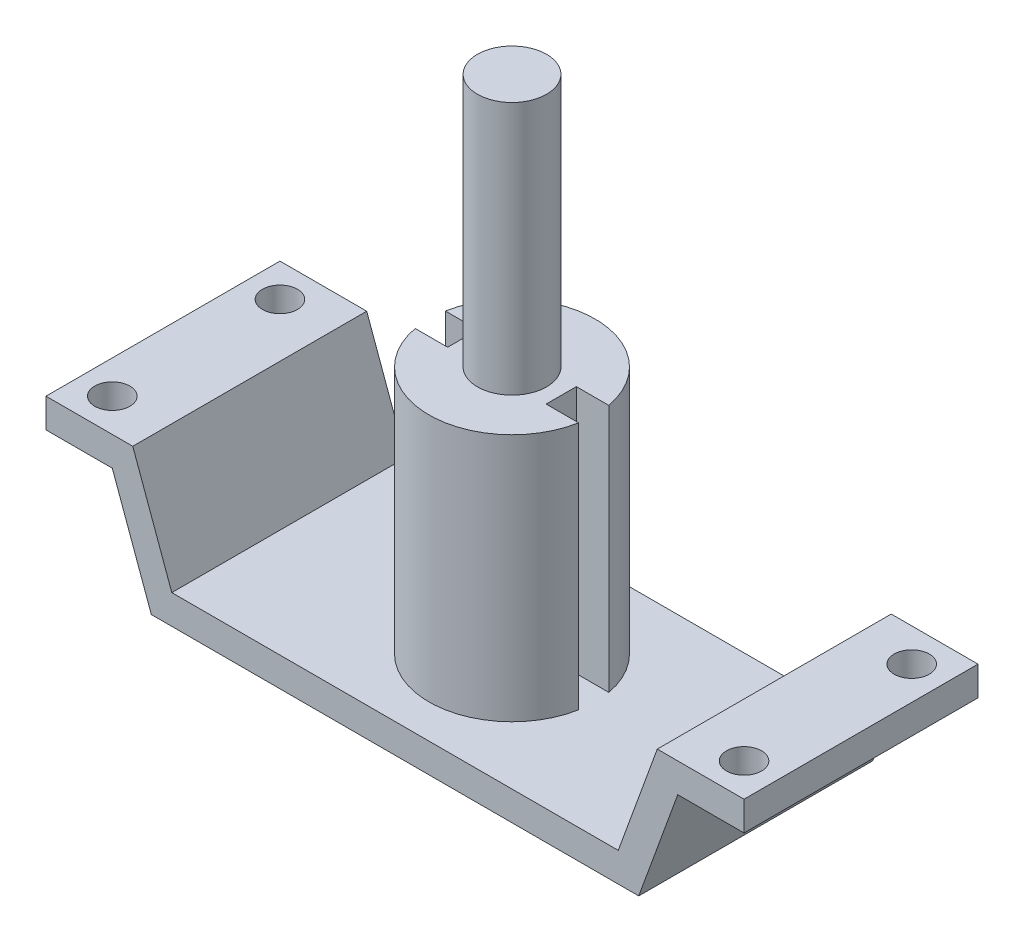
ISO-10303-21;
HEADER;
FILE_DESCRIPTION(('STEP AP214'),'2;1');
FILE_NAME('part.step','',(''),(''),'','','');
FILE_SCHEMA(('AUTOMOTIVE_DESIGN { 1 0 10303 214 1 1 1 1 }'));
ENDSEC;
DATA;
#1=APPLICATION_CONTEXT('core data for automotive mechanical design processes');
#2=APPLICATION_PROTOCOL_DEFINITION('international standard','automotive_design',2000,#1);
#3=PRODUCT_CONTEXT('',#1,'mechanical');
#4=PRODUCT('Part','Part','',(#3));
#5=PRODUCT_RELATED_PRODUCT_CATEGORY('part','',(#4));
#6=PRODUCT_DEFINITION_FORMATION('','',#4);
#7=PRODUCT_DEFINITION_CONTEXT('part definition',#1,'design');
#8=PRODUCT_DEFINITION('design','',#6,#7);
#9=PRODUCT_DEFINITION_SHAPE('','',#8);
#10=(LENGTH_UNIT() NAMED_UNIT(*) SI_UNIT(.MILLI.,.METRE.));
#11=(NAMED_UNIT(*) PLANE_ANGLE_UNIT() SI_UNIT($,.RADIAN.));
#12=(NAMED_UNIT(*) SI_UNIT($,.STERADIAN.) SOLID_ANGLE_UNIT());
#13=UNCERTAINTY_MEASURE_WITH_UNIT(LENGTH_MEASURE(1.E-05),#10,'distance_accuracy_value','');
#14=(GEOMETRIC_REPRESENTATION_CONTEXT(3) GLOBAL_UNCERTAINTY_ASSIGNED_CONTEXT((#13)) GLOBAL_UNIT_ASSIGNED_CONTEXT((#10,
#11,#12)) REPRESENTATION_CONTEXT('',''));
#15=CARTESIAN_POINT('',(0.,0.,0.));
#16=DIRECTION('',(0.,0.,1.));
#17=DIRECTION('',(1.,0.,0.));
#18=AXIS2_PLACEMENT_3D('',#15,#16,#17);
#19=CARTESIAN_POINT('',(0.,28.5,0.));
#20=DIRECTION('',(0.,-1.,0.));
#21=DIRECTION('',(0.,0.,-1.));
#22=AXIS2_PLACEMENT_3D('',#19,#20,#21);
#23=CYLINDRICAL_SURFACE('',#22,8.525);
#24=CARTESIAN_POINT('',(0.,28.5,0.));
#25=DIRECTION('',(0.,1.,0.));
#26=DIRECTION('',(0.,0.,1.));
#27=AXIS2_PLACEMENT_3D('',#24,#25,#26);
#28=CIRCLE('',#27,8.525);
#29=CARTESIAN_POINT('',(-8.38290671545377,28.5,1.55));
#30=VERTEX_POINT('',#29);
#31=CARTESIAN_POINT('',(8.38290671545377,28.5,1.55));
#32=VERTEX_POINT('',#31);
#33=EDGE_CURVE('E241',#30,#32,#28,.T.);
#34=ORIENTED_EDGE('',*,*,#33,.F.);
#35=DIRECTION('',(0.,-1.,0.));
#36=VECTOR('',#35,1.);
#37=CARTESIAN_POINT('',(-8.38290671545377,28.5,1.55));
#38=LINE('',#37,#36);
#39=CARTESIAN_POINT('',(-8.38290671545377,3.,1.55));
#40=VERTEX_POINT('',#39);
#41=EDGE_CURVE('E184',#30,#40,#38,.T.);
#42=ORIENTED_EDGE('',*,*,#41,.T.);
#43=CARTESIAN_POINT('',(0.,3.,0.));
#44=DIRECTION('',(0.,1.,0.));
#45=DIRECTION('',(0.,0.,1.));
#46=AXIS2_PLACEMENT_3D('',#43,#44,#45);
#47=CIRCLE('',#46,8.525);
#48=CARTESIAN_POINT('',(8.38290671545377,3.,1.55));
#49=VERTEX_POINT('',#48);
#50=EDGE_CURVE('E236',#40,#49,#47,.T.);
#51=ORIENTED_EDGE('',*,*,#50,.T.);
#52=DIRECTION('',(0.,-1.,0.));
#53=VECTOR('',#52,1.);
#54=CARTESIAN_POINT('',(8.38290671545377,28.5,1.55));
#55=LINE('',#54,#53);
#56=EDGE_CURVE('E226',#49,#32,#55,.F.);
#57=ORIENTED_EDGE('',*,*,#56,.T.);
#58=EDGE_LOOP('',(#34,#42,#51,#57));
#59=FACE_BOUND('',#58,.T.);
#60=ADVANCED_FACE('F43',(#59),#23,.T.);
#61=CARTESIAN_POINT('',(-25.,3.,-12.));
#62=DIRECTION('',(0.,0.,1.));
#63=DIRECTION('',(1.,0.,0.));
#64=AXIS2_PLACEMENT_3D('',#61,#62,#63);
#65=PLANE('',#64);
#66=DIRECTION('',(0.342020143325672,0.939692620785907,0.));
#67=VECTOR('',#66,1.);
#68=CARTESIAN_POINT('',(25.,0.,-12.));
#69=LINE('',#68,#67);
#70=CARTESIAN_POINT('',(25.,0.,-12.));
#71=VERTEX_POINT('',#70);
#72=CARTESIAN_POINT('',(29.0036725769283,11.,-12.));
#73=VERTEX_POINT('',#72);
#74=EDGE_CURVE('E263',#71,#73,#69,.T.);
#75=ORIENTED_EDGE('',*,*,#74,.F.);
#76=DIRECTION('',(-1.,0.,0.));
#77=VECTOR('',#76,1.);
#78=CARTESIAN_POINT('',(-25.,0.,-12.));
#79=LINE('',#78,#77);
#80=CARTESIAN_POINT('',(-25.,0.,-12.));
#81=VERTEX_POINT('',#80);
#82=EDGE_CURVE('E335',#71,#81,#79,.T.);
#83=ORIENTED_EDGE('',*,*,#82,.T.);
#84=DIRECTION('',(0.342020143325672,-0.939692620785907,0.));
#85=VECTOR('',#84,1.);
#86=CARTESIAN_POINT('',(-25.,0.,-12.));
#87=LINE('',#86,#85);
#88=CARTESIAN_POINT('',(-29.0036725769283,11.,-12.));
#89=VERTEX_POINT('',#88);
#90=EDGE_CURVE('E302',#89,#81,#87,.T.);
#91=ORIENTED_EDGE('',*,*,#90,.F.);
#92=DIRECTION('',(1.,0.,0.));
#93=VECTOR('',#92,1.);
#94=CARTESIAN_POINT('',(-29.0036725769283,11.,-12.));
#95=LINE('',#94,#93);
#96=CARTESIAN_POINT('',(-35.8036725769283,11.,-12.));
#97=VERTEX_POINT('',#96);
#98=EDGE_CURVE('E299',#97,#89,#95,.T.);
#99=ORIENTED_EDGE('',*,*,#98,.F.);
#100=DIRECTION('',(0.,-1.,0.));
#101=VECTOR('',#100,1.);
#102=CARTESIAN_POINT('',(-35.8036725769283,11.,-12.));
#103=LINE('',#102,#101);
#104=CARTESIAN_POINT('',(-35.8036725769283,14.,-12.));
#105=VERTEX_POINT('',#104);
#106=EDGE_CURVE('E296',#105,#97,#103,.T.);
#107=ORIENTED_EDGE('',*,*,#106,.F.);
#108=DIRECTION('',(-1.,0.,0.));
#109=VECTOR('',#108,1.);
#110=CARTESIAN_POINT('',(-35.8036725769283,14.,-12.));
#111=LINE('',#110,#109);
#112=CARTESIAN_POINT('',(-26.9030499622992,14.,-12.));
#113=VERTEX_POINT('',#112);
#114=EDGE_CURVE('E292',#113,#105,#111,.T.);
#115=ORIENTED_EDGE('',*,*,#114,.F.);
#116=DIRECTION('',(-0.342020143325673,0.939692620785907,0.));
#117=VECTOR('',#116,1.);
#118=CARTESIAN_POINT('',(-26.9030499622992,14.,-12.));
#119=LINE('',#118,#117);
#120=CARTESIAN_POINT('',(-22.8993773853709,3.,-12.));
#121=VERTEX_POINT('',#120);
#122=EDGE_CURVE('E289',#121,#113,#119,.T.);
#123=ORIENTED_EDGE('',*,*,#122,.F.);
#124=DIRECTION('',(-1.,0.,0.));
#125=VECTOR('',#124,1.);
#126=CARTESIAN_POINT('',(-25.,3.,-12.));
#127=LINE('',#126,#125);
#128=CARTESIAN_POINT('',(22.8993773853709,3.,-12.));
#129=VERTEX_POINT('',#128);
#130=EDGE_CURVE('E329',#129,#121,#127,.T.);
#131=ORIENTED_EDGE('',*,*,#130,.F.);
#132=DIRECTION('',(-0.342020143325673,-0.939692620785907,0.));
#133=VECTOR('',#132,1.);
#134=CARTESIAN_POINT('',(26.9030499622992,14.,-12.));
#135=LINE('',#134,#133);
#136=CARTESIAN_POINT('',(26.9030499622992,14.,-12.));
#137=VERTEX_POINT('',#136);
#138=EDGE_CURVE('E249',#137,#129,#135,.T.);
#139=ORIENTED_EDGE('',*,*,#138,.F.);
#140=DIRECTION('',(-1.,0.,0.));
#141=VECTOR('',#140,1.);
#142=CARTESIAN_POINT('',(35.8036725769283,14.,-12.));
#143=LINE('',#142,#141);
#144=CARTESIAN_POINT('',(35.8036725769283,14.,-12.));
#145=VERTEX_POINT('',#144);
#146=EDGE_CURVE('E278',#145,#137,#143,.T.);
#147=ORIENTED_EDGE('',*,*,#146,.F.);
#148=DIRECTION('',(0.,1.,0.));
#149=VECTOR('',#148,1.);
#150=CARTESIAN_POINT('',(35.8036725769283,11.,-12.));
#151=LINE('',#150,#149);
#152=CARTESIAN_POINT('',(35.8036725769283,11.,-12.));
#153=VERTEX_POINT('',#152);
#154=EDGE_CURVE('E281',#153,#145,#151,.T.);
#155=ORIENTED_EDGE('',*,*,#154,.F.);
#156=DIRECTION('',(1.,0.,0.));
#157=VECTOR('',#156,1.);
#158=CARTESIAN_POINT('',(29.0036725769283,11.,-12.));
#159=LINE('',#158,#157);
#160=EDGE_CURVE('E284',#73,#153,#159,.T.);
#161=ORIENTED_EDGE('',*,*,#160,.F.);
#162=EDGE_LOOP('',(#75,#83,#91,#99,#107,#115,#123,#131,#139,#147,#155,#161));
#163=FACE_BOUND('',#162,.T.);
#164=ADVANCED_FACE('F45',(#163),#65,.F.);
#165=CARTESIAN_POINT('',(-25.,3.,12.));
#166=DIRECTION('',(0.,0.,-1.));
#167=DIRECTION('',(-1.,0.,0.));
#168=AXIS2_PLACEMENT_3D('',#165,#166,#167);
#169=PLANE('',#168);
#170=DIRECTION('',(1.,0.,0.));
#171=VECTOR('',#170,1.);
#172=CARTESIAN_POINT('',(-25.,0.,12.));
#173=LINE('',#172,#171);
#174=CARTESIAN_POINT('',(-25.,0.,12.));
#175=VERTEX_POINT('',#174);
#176=CARTESIAN_POINT('',(25.,0.,12.));
#177=VERTEX_POINT('',#176);
#178=EDGE_CURVE('E331',#175,#177,#173,.T.);
#179=ORIENTED_EDGE('',*,*,#178,.T.);
#180=DIRECTION('',(0.342020143325672,0.939692620785907,0.));
#181=VECTOR('',#180,1.);
#182=CARTESIAN_POINT('',(25.,0.,12.));
#183=LINE('',#182,#181);
#184=CARTESIAN_POINT('',(29.0036725769283,11.,12.));
#185=VERTEX_POINT('',#184);
#186=EDGE_CURVE('E272',#177,#185,#183,.T.);
#187=ORIENTED_EDGE('',*,*,#186,.T.);
#188=DIRECTION('',(1.,0.,0.));
#189=VECTOR('',#188,1.);
#190=CARTESIAN_POINT('',(29.0036725769283,11.,12.));
#191=LINE('',#190,#189);
#192=CARTESIAN_POINT('',(35.8036725769283,11.,12.));
#193=VERTEX_POINT('',#192);
#194=EDGE_CURVE('E269',#185,#193,#191,.T.);
#195=ORIENTED_EDGE('',*,*,#194,.T.);
#196=DIRECTION('',(0.,1.,0.));
#197=VECTOR('',#196,1.);
#198=CARTESIAN_POINT('',(35.8036725769283,11.,12.));
#199=LINE('',#198,#197);
#200=CARTESIAN_POINT('',(35.8036725769283,14.,12.));
#201=VERTEX_POINT('',#200);
#202=EDGE_CURVE('E266',#193,#201,#199,.T.);
#203=ORIENTED_EDGE('',*,*,#202,.T.);
#204=DIRECTION('',(-1.,0.,0.));
#205=VECTOR('',#204,1.);
#206=CARTESIAN_POINT('',(35.8036725769283,14.,12.));
#207=LINE('',#206,#205);
#208=CARTESIAN_POINT('',(26.9030499622992,14.,12.));
#209=VERTEX_POINT('',#208);
#210=EDGE_CURVE('E262',#201,#209,#207,.T.);
#211=ORIENTED_EDGE('',*,*,#210,.T.);
#212=DIRECTION('',(-0.342020143325673,-0.939692620785907,0.));
#213=VECTOR('',#212,1.);
#214=CARTESIAN_POINT('',(26.9030499622992,14.,12.));
#215=LINE('',#214,#213);
#216=CARTESIAN_POINT('',(22.8993773853709,3.,12.));
#217=VERTEX_POINT('',#216);
#218=EDGE_CURVE('E259',#209,#217,#215,.T.);
#219=ORIENTED_EDGE('',*,*,#218,.T.);
#220=DIRECTION('',(1.,0.,0.));
#221=VECTOR('',#220,1.);
#222=CARTESIAN_POINT('',(-25.,3.,12.));
#223=LINE('',#222,#221);
#224=CARTESIAN_POINT('',(-22.8993773853709,3.,12.));
#225=VERTEX_POINT('',#224);
#226=EDGE_CURVE('E240',#225,#217,#223,.T.);
#227=ORIENTED_EDGE('',*,*,#226,.F.);
#228=DIRECTION('',(-0.342020143325673,0.939692620785907,0.));
#229=VECTOR('',#228,1.);
#230=CARTESIAN_POINT('',(-26.9030499622992,14.,12.));
#231=LINE('',#230,#229);
#232=CARTESIAN_POINT('',(-26.9030499622992,14.,12.));
#233=VERTEX_POINT('',#232);
#234=EDGE_CURVE('E275',#225,#233,#231,.T.);
#235=ORIENTED_EDGE('',*,*,#234,.T.);
#236=DIRECTION('',(-1.,0.,0.));
#237=VECTOR('',#236,1.);
#238=CARTESIAN_POINT('',(-35.8036725769283,14.,12.));
#239=LINE('',#238,#237);
#240=CARTESIAN_POINT('',(-35.8036725769283,14.,12.));
#241=VERTEX_POINT('',#240);
#242=EDGE_CURVE('E308',#233,#241,#239,.T.);
#243=ORIENTED_EDGE('',*,*,#242,.T.);
#244=DIRECTION('',(0.,-1.,0.));
#245=VECTOR('',#244,1.);
#246=CARTESIAN_POINT('',(-35.8036725769283,11.,12.));
#247=LINE('',#246,#245);
#248=CARTESIAN_POINT('',(-35.8036725769283,11.,12.));
#249=VERTEX_POINT('',#248);
#250=EDGE_CURVE('E311',#241,#249,#247,.T.);
#251=ORIENTED_EDGE('',*,*,#250,.T.);
#252=DIRECTION('',(1.,0.,0.));
#253=VECTOR('',#252,1.);
#254=CARTESIAN_POINT('',(-29.0036725769283,11.,12.));
#255=LINE('',#254,#253);
#256=CARTESIAN_POINT('',(-29.0036725769283,11.,12.));
#257=VERTEX_POINT('',#256);
#258=EDGE_CURVE('E314',#249,#257,#255,.T.);
#259=ORIENTED_EDGE('',*,*,#258,.T.);
#260=DIRECTION('',(0.342020143325672,-0.939692620785907,0.));
#261=VECTOR('',#260,1.);
#262=CARTESIAN_POINT('',(-25.,0.,12.));
#263=LINE('',#262,#261);
#264=EDGE_CURVE('E293',#257,#175,#263,.T.);
#265=ORIENTED_EDGE('',*,*,#264,.T.);
#266=EDGE_LOOP('',(#179,#187,#195,#203,#211,#219,#227,#235,#243,#251,#259,#265));
#267=FACE_BOUND('',#266,.T.);
#268=ADVANCED_FACE('F414',(#267),#169,.F.);
#269=CARTESIAN_POINT('',(0.,3.,0.));
#270=DIRECTION('',(0.,1.,0.));
#271=DIRECTION('',(0.,0.,1.));
#272=AXIS2_PLACEMENT_3D('',#269,#270,#271);
#273=PLANE('',#272);
#274=ORIENTED_EDGE('',*,*,#50,.F.);
#275=DIRECTION('',(-1.,0.,0.));
#276=VECTOR('',#275,1.);
#277=CARTESIAN_POINT('',(-9.05,3.,1.55));
#278=LINE('',#277,#276);
#279=CARTESIAN_POINT('',(-5.05,3.,1.55));
#280=VERTEX_POINT('',#279);
#281=EDGE_CURVE('E192',#280,#40,#278,.T.);
#282=ORIENTED_EDGE('',*,*,#281,.F.);
#283=DIRECTION('',(0.,0.,1.));
#284=VECTOR('',#283,1.);
#285=CARTESIAN_POINT('',(-5.05,3.,-1.55));
#286=LINE('',#285,#284);
#287=CARTESIAN_POINT('',(-5.05,3.,-1.55));
#288=VERTEX_POINT('',#287);
#289=EDGE_CURVE('E190',#288,#280,#286,.T.);
#290=ORIENTED_EDGE('',*,*,#289,.F.);
#291=DIRECTION('',(1.,0.,0.));
#292=VECTOR('',#291,1.);
#293=CARTESIAN_POINT('',(-9.05,3.,-1.55));
#294=LINE('',#293,#292);
#295=CARTESIAN_POINT('',(-8.38290671545377,3.,-1.55));
#296=VERTEX_POINT('',#295);
#297=EDGE_CURVE('E210',#296,#288,#294,.T.);
#298=ORIENTED_EDGE('',*,*,#297,.F.);
#299=CARTESIAN_POINT('',(8.38290671545377,3.,-1.55));
#300=VERTEX_POINT('',#299);
#301=EDGE_CURVE('E244',#300,#296,#47,.T.);
#302=ORIENTED_EDGE('',*,*,#301,.F.);
#303=DIRECTION('',(1.,0.,0.));
#304=VECTOR('',#303,1.);
#305=CARTESIAN_POINT('',(9.05,3.,-1.55));
#306=LINE('',#305,#304);
#307=CARTESIAN_POINT('',(5.05,3.,-1.55));
#308=VERTEX_POINT('',#307);
#309=EDGE_CURVE('E212',#308,#300,#306,.T.);
#310=ORIENTED_EDGE('',*,*,#309,.F.);
#311=DIRECTION('',(0.,0.,-1.));
#312=VECTOR('',#311,1.);
#313=CARTESIAN_POINT('',(5.05,3.,-1.55));
#314=LINE('',#313,#312);
#315=CARTESIAN_POINT('',(5.05,3.,1.55));
#316=VERTEX_POINT('',#315);
#317=EDGE_CURVE('E221',#316,#308,#314,.T.);
#318=ORIENTED_EDGE('',*,*,#317,.F.);
#319=DIRECTION('',(-1.,0.,0.));
#320=VECTOR('',#319,1.);
#321=CARTESIAN_POINT('',(9.05,3.,1.55));
#322=LINE('',#321,#320);
#323=EDGE_CURVE('E214',#49,#316,#322,.T.);
#324=ORIENTED_EDGE('',*,*,#323,.F.);
#325=EDGE_LOOP('',(#274,#282,#290,#298,#302,#310,#318,#324));
#326=FACE_BOUND('',#325,.T.);
#327=DIRECTION('',(0.,0.,1.));
#328=VECTOR('',#327,1.);
#329=CARTESIAN_POINT('',(22.8993773853709,3.,-12.));
#330=LINE('',#329,#328);
#331=EDGE_CURVE('E256',#129,#217,#330,.T.);
#332=ORIENTED_EDGE('',*,*,#331,.F.);
#333=ORIENTED_EDGE('',*,*,#130,.T.);
#334=DIRECTION('',(0.,0.,1.));
#335=VECTOR('',#334,1.);
#336=CARTESIAN_POINT('',(-22.8993773853709,3.,-12.));
#337=LINE('',#336,#335);
#338=EDGE_CURVE('E305',#121,#225,#337,.T.);
#339=ORIENTED_EDGE('',*,*,#338,.T.);
#340=ORIENTED_EDGE('',*,*,#226,.T.);
#341=EDGE_LOOP('',(#332,#333,#339,#340));
#342=FACE_BOUND('',#341,.T.);
#343=ADVANCED_FACE('F356',(#326,#342),#273,.T.);
#344=CARTESIAN_POINT('',(0.,0.,0.));
#345=DIRECTION('',(0.,1.,0.));
#346=DIRECTION('',(0.,0.,1.));
#347=AXIS2_PLACEMENT_3D('',#344,#345,#346);
#348=PLANE('',#347);
#349=DIRECTION('',(0.,0.,-1.));
#350=VECTOR('',#349,1.);
#351=CARTESIAN_POINT('',(25.,0.,-12.));
#352=LINE('',#351,#350);
#353=EDGE_CURVE('E321',#177,#71,#352,.T.);
#354=ORIENTED_EDGE('',*,*,#353,.F.);
#355=ORIENTED_EDGE('',*,*,#178,.F.);
#356=DIRECTION('',(0.,0.,1.));
#357=VECTOR('',#356,1.);
#358=CARTESIAN_POINT('',(-25.,0.,-12.));
#359=LINE('',#358,#357);
#360=EDGE_CURVE('E337',#81,#175,#359,.T.);
#361=ORIENTED_EDGE('',*,*,#360,.F.);
#362=ORIENTED_EDGE('',*,*,#82,.F.);
#363=EDGE_LOOP('',(#354,#355,#361,#362));
#364=FACE_BOUND('',#363,.T.);
#365=ADVANCED_FACE('F434',(#364),#348,.F.);
#366=CARTESIAN_POINT('',(-25.,0.,-12.));
#367=DIRECTION('',(-0.939692620785907,-0.342020143325672,0.));
#368=DIRECTION('',(0.342020143325672,-0.939692620785907,0.));
#369=AXIS2_PLACEMENT_3D('',#366,#367,#368);
#370=PLANE('',#369);
#371=ORIENTED_EDGE('',*,*,#264,.F.);
#372=DIRECTION('',(0.,0.,1.));
#373=VECTOR('',#372,1.);
#374=CARTESIAN_POINT('',(-29.0036725769283,11.,-12.));
#375=LINE('',#374,#373);
#376=EDGE_CURVE('E319',#89,#257,#375,.T.);
#377=ORIENTED_EDGE('',*,*,#376,.F.);
#378=ORIENTED_EDGE('',*,*,#90,.T.);
#379=ORIENTED_EDGE('',*,*,#360,.T.);
#380=EDGE_LOOP('',(#371,#377,#378,#379));
#381=FACE_BOUND('',#380,.T.);
#382=ADVANCED_FACE('F430',(#381),#370,.T.);
#383=CARTESIAN_POINT('',(-29.0036725769283,11.,-12.));
#384=DIRECTION('',(0.,-1.,0.));
#385=DIRECTION('',(1.,0.,0.));
#386=AXIS2_PLACEMENT_3D('',#383,#384,#385);
#387=PLANE('',#386);
#388=CARTESIAN_POINT('',(-32.4036725769283,11.,8.6));
#389=DIRECTION('',(0.,-1.,0.));
#390=DIRECTION('',(1.,0.,0.));
#391=AXIS2_PLACEMENT_3D('',#388,#389,#390);
#392=CIRCLE('',#391,1.8);
#393=CARTESIAN_POINT('',(-30.6036725769283,11.,8.6));
#394=VERTEX_POINT('',#393);
#395=EDGE_CURVE('E369',#394,#394,#392,.F.);
#396=ORIENTED_EDGE('',*,*,#395,.T.);
#397=EDGE_LOOP('',(#396));
#398=FACE_BOUND('',#397,.T.);
#399=CARTESIAN_POINT('',(-32.4036725769283,11.,-8.6));
#400=DIRECTION('',(0.,-1.,0.));
#401=DIRECTION('',(1.,0.,0.));
#402=AXIS2_PLACEMENT_3D('',#399,#400,#401);
#403=CIRCLE('',#402,1.8);
#404=CARTESIAN_POINT('',(-30.6036725769283,11.,-8.6));
#405=VERTEX_POINT('',#404);
#406=EDGE_CURVE('E366',#405,#405,#403,.F.);
#407=ORIENTED_EDGE('',*,*,#406,.T.);
#408=EDGE_LOOP('',(#407));
#409=FACE_BOUND('',#408,.T.);
#410=ORIENTED_EDGE('',*,*,#258,.F.);
#411=DIRECTION('',(0.,0.,1.));
#412=VECTOR('',#411,1.);
#413=CARTESIAN_POINT('',(-35.8036725769283,11.,-12.));
#414=LINE('',#413,#412);
#415=EDGE_CURVE('E322',#97,#249,#414,.T.);
#416=ORIENTED_EDGE('',*,*,#415,.F.);
#417=ORIENTED_EDGE('',*,*,#98,.T.);
#418=ORIENTED_EDGE('',*,*,#376,.T.);
#419=EDGE_LOOP('',(#410,#416,#417,#418));
#420=FACE_BOUND('',#419,.T.);
#421=ADVANCED_FACE('F390',(#398,#409,#420),#387,.T.);
#422=CARTESIAN_POINT('',(-35.8036725769283,11.,-12.));
#423=DIRECTION('',(-1.,0.,0.));
#424=DIRECTION('',(0.,0.,1.));
#425=AXIS2_PLACEMENT_3D('',#422,#423,#424);
#426=PLANE('',#425);
#427=ORIENTED_EDGE('',*,*,#250,.F.);
#428=DIRECTION('',(0.,0.,1.));
#429=VECTOR('',#428,1.);
#430=CARTESIAN_POINT('',(-35.8036725769283,14.,-12.));
#431=LINE('',#430,#429);
#432=EDGE_CURVE('E324',#105,#241,#431,.T.);
#433=ORIENTED_EDGE('',*,*,#432,.F.);
#434=ORIENTED_EDGE('',*,*,#106,.T.);
#435=ORIENTED_EDGE('',*,*,#415,.T.);
#436=EDGE_LOOP('',(#427,#433,#434,#435));
#437=FACE_BOUND('',#436,.T.);
#438=ADVANCED_FACE('F404',(#437),#426,.T.);
#439=CARTESIAN_POINT('',(-35.8036725769283,14.,-12.));
#440=DIRECTION('',(0.,1.,0.));
#441=DIRECTION('',(0.,0.,1.));
#442=AXIS2_PLACEMENT_3D('',#439,#440,#441);
#443=PLANE('',#442);
#444=CARTESIAN_POINT('',(-32.4036725769283,14.,8.6));
#445=DIRECTION('',(0.,1.,0.));
#446=DIRECTION('',(0.,0.,-1.));
#447=AXIS2_PLACEMENT_3D('',#444,#445,#446);
#448=CIRCLE('',#447,1.8);
#449=CARTESIAN_POINT('',(-32.4036725769283,14.,6.8));
#450=VERTEX_POINT('',#449);
#451=EDGE_CURVE('E384',#450,#450,#448,.T.);
#452=ORIENTED_EDGE('',*,*,#451,.F.);
#453=EDGE_LOOP('',(#452));
#454=FACE_BOUND('',#453,.T.);
#455=CARTESIAN_POINT('',(-32.4036725769283,14.,-8.6));
#456=DIRECTION('',(0.,1.,0.));
#457=DIRECTION('',(0.,0.,1.));
#458=AXIS2_PLACEMENT_3D('',#455,#456,#457);
#459=CIRCLE('',#458,1.8);
#460=CARTESIAN_POINT('',(-32.4036725769283,14.,-6.8));
#461=VERTEX_POINT('',#460);
#462=EDGE_CURVE('E215',#461,#461,#459,.T.);
#463=ORIENTED_EDGE('',*,*,#462,.F.);
#464=EDGE_LOOP('',(#463));
#465=FACE_BOUND('',#464,.T.);
#466=ORIENTED_EDGE('',*,*,#242,.F.);
#467=DIRECTION('',(0.,0.,1.));
#468=VECTOR('',#467,1.);
#469=CARTESIAN_POINT('',(-26.9030499622992,14.,-12.));
#470=LINE('',#469,#468);
#471=EDGE_CURVE('E326',#113,#233,#470,.T.);
#472=ORIENTED_EDGE('',*,*,#471,.F.);
#473=ORIENTED_EDGE('',*,*,#114,.T.);
#474=ORIENTED_EDGE('',*,*,#432,.T.);
#475=EDGE_LOOP('',(#466,#472,#473,#474));
#476=FACE_BOUND('',#475,.T.);
#477=ADVANCED_FACE('F400',(#454,#465,#476),#443,.T.);
#478=CARTESIAN_POINT('',(-26.9030499622992,14.,-12.));
#479=DIRECTION('',(0.939692620785907,0.342020143325673,0.));
#480=DIRECTION('',(-0.342020143325673,0.939692620785907,0.));
#481=AXIS2_PLACEMENT_3D('',#478,#479,#480);
#482=PLANE('',#481);
#483=ORIENTED_EDGE('',*,*,#234,.F.);
#484=ORIENTED_EDGE('',*,*,#338,.F.);
#485=ORIENTED_EDGE('',*,*,#122,.T.);
#486=ORIENTED_EDGE('',*,*,#471,.T.);
#487=EDGE_LOOP('',(#483,#484,#485,#486));
#488=FACE_BOUND('',#487,.T.);
#489=ADVANCED_FACE('F403',(#488),#482,.T.);
#490=CARTESIAN_POINT('',(26.9030499622992,14.,-12.));
#491=DIRECTION('',(-0.939692620785907,0.342020143325673,0.));
#492=DIRECTION('',(-0.342020143325673,-0.939692620785907,0.));
#493=AXIS2_PLACEMENT_3D('',#490,#491,#492);
#494=PLANE('',#493);
#495=ORIENTED_EDGE('',*,*,#218,.F.);
#496=DIRECTION('',(0.,0.,1.));
#497=VECTOR('',#496,1.);
#498=CARTESIAN_POINT('',(26.9030499622992,14.,-12.));
#499=LINE('',#498,#497);
#500=EDGE_CURVE('E254',#137,#209,#499,.T.);
#501=ORIENTED_EDGE('',*,*,#500,.F.);
#502=ORIENTED_EDGE('',*,*,#138,.T.);
#503=ORIENTED_EDGE('',*,*,#331,.T.);
#504=EDGE_LOOP('',(#495,#501,#502,#503));
#505=FACE_BOUND('',#504,.T.);
#506=ADVANCED_FACE('F450',(#505),#494,.T.);
#507=CARTESIAN_POINT('',(35.8036725769283,14.,-12.));
#508=DIRECTION('',(0.,1.,0.));
#509=DIRECTION('',(0.,0.,1.));
#510=AXIS2_PLACEMENT_3D('',#507,#508,#509);
#511=PLANE('',#510);
#512=CARTESIAN_POINT('',(32.4036725769283,14.,-8.6));
#513=DIRECTION('',(0.,1.,0.));
#514=DIRECTION('',(0.,0.,-1.));
#515=AXIS2_PLACEMENT_3D('',#512,#513,#514);
#516=CIRCLE('',#515,1.8);
#517=CARTESIAN_POINT('',(32.4036725769283,14.,-10.4));
#518=VERTEX_POINT('',#517);
#519=EDGE_CURVE('E372',#518,#518,#516,.T.);
#520=ORIENTED_EDGE('',*,*,#519,.F.);
#521=EDGE_LOOP('',(#520));
#522=FACE_BOUND('',#521,.T.);
#523=CARTESIAN_POINT('',(32.4036725769283,14.,8.6));
#524=DIRECTION('',(0.,1.,0.));
#525=DIRECTION('',(0.,0.,1.));
#526=AXIS2_PLACEMENT_3D('',#523,#524,#525);
#527=CIRCLE('',#526,1.8);
#528=CARTESIAN_POINT('',(32.4036725769283,14.,10.4));
#529=VERTEX_POINT('',#528);
#530=EDGE_CURVE('E378',#529,#529,#527,.T.);
#531=ORIENTED_EDGE('',*,*,#530,.F.);
#532=EDGE_LOOP('',(#531));
#533=FACE_BOUND('',#532,.T.);
#534=ORIENTED_EDGE('',*,*,#210,.F.);
#535=DIRECTION('',(0.,0.,1.));
#536=VECTOR('',#535,1.);
#537=CARTESIAN_POINT('',(35.8036725769283,14.,-12.));
#538=LINE('',#537,#536);
#539=EDGE_CURVE('E252',#145,#201,#538,.T.);
#540=ORIENTED_EDGE('',*,*,#539,.F.);
#541=ORIENTED_EDGE('',*,*,#146,.T.);
#542=ORIENTED_EDGE('',*,*,#500,.T.);
#543=EDGE_LOOP('',(#534,#540,#541,#542));
#544=FACE_BOUND('',#543,.T.);
#545=ADVANCED_FACE('F482',(#522,#533,#544),#511,.T.);
#546=CARTESIAN_POINT('',(35.8036725769283,11.,-12.));
#547=DIRECTION('',(1.,0.,0.));
#548=DIRECTION('',(0.,0.,-1.));
#549=AXIS2_PLACEMENT_3D('',#546,#547,#548);
#550=PLANE('',#549);
#551=ORIENTED_EDGE('',*,*,#202,.F.);
#552=DIRECTION('',(0.,0.,1.));
#553=VECTOR('',#552,1.);
#554=CARTESIAN_POINT('',(35.8036725769283,11.,-12.));
#555=LINE('',#554,#553);
#556=EDGE_CURVE('E250',#153,#193,#555,.T.);
#557=ORIENTED_EDGE('',*,*,#556,.F.);
#558=ORIENTED_EDGE('',*,*,#154,.T.);
#559=ORIENTED_EDGE('',*,*,#539,.T.);
#560=EDGE_LOOP('',(#551,#557,#558,#559));
#561=FACE_BOUND('',#560,.T.);
#562=ADVANCED_FACE('F445',(#561),#550,.T.);
#563=CARTESIAN_POINT('',(29.0036725769283,11.,-12.));
#564=DIRECTION('',(0.,-1.,0.));
#565=DIRECTION('',(1.,0.,0.));
#566=AXIS2_PLACEMENT_3D('',#563,#564,#565);
#567=PLANE('',#566);
#568=CARTESIAN_POINT('',(32.4036725769283,11.,-8.6));
#569=DIRECTION('',(0.,-1.,0.));
#570=DIRECTION('',(1.,0.,0.));
#571=AXIS2_PLACEMENT_3D('',#568,#569,#570);
#572=CIRCLE('',#571,1.8);
#573=CARTESIAN_POINT('',(34.2036725769283,11.,-8.6));
#574=VERTEX_POINT('',#573);
#575=EDGE_CURVE('E375',#574,#574,#572,.F.);
#576=ORIENTED_EDGE('',*,*,#575,.T.);
#577=EDGE_LOOP('',(#576));
#578=FACE_BOUND('',#577,.T.);
#579=CARTESIAN_POINT('',(32.4036725769283,11.,8.6));
#580=DIRECTION('',(0.,-1.,0.));
#581=DIRECTION('',(1.,0.,0.));
#582=AXIS2_PLACEMENT_3D('',#579,#580,#581);
#583=CIRCLE('',#582,1.8);
#584=CARTESIAN_POINT('',(34.2036725769283,11.,8.6));
#585=VERTEX_POINT('',#584);
#586=EDGE_CURVE('E381',#585,#585,#583,.F.);
#587=ORIENTED_EDGE('',*,*,#586,.T.);
#588=EDGE_LOOP('',(#587));
#589=FACE_BOUND('',#588,.T.);
#590=ORIENTED_EDGE('',*,*,#194,.F.);
#591=DIRECTION('',(0.,0.,1.));
#592=VECTOR('',#591,1.);
#593=CARTESIAN_POINT('',(29.0036725769283,11.,-12.));
#594=LINE('',#593,#592);
#595=EDGE_CURVE('E247',#73,#185,#594,.T.);
#596=ORIENTED_EDGE('',*,*,#595,.F.);
#597=ORIENTED_EDGE('',*,*,#160,.T.);
#598=ORIENTED_EDGE('',*,*,#556,.T.);
#599=EDGE_LOOP('',(#590,#596,#597,#598));
#600=FACE_BOUND('',#599,.T.);
#601=ADVANCED_FACE('F441',(#578,#589,#600),#567,.T.);
#602=CARTESIAN_POINT('',(25.,0.,-12.));
#603=DIRECTION('',(0.939692620785907,-0.342020143325672,0.));
#604=DIRECTION('',(0.342020143325672,0.939692620785907,0.));
#605=AXIS2_PLACEMENT_3D('',#602,#603,#604);
#606=PLANE('',#605);
#607=ORIENTED_EDGE('',*,*,#186,.F.);
#608=ORIENTED_EDGE('',*,*,#353,.T.);
#609=ORIENTED_EDGE('',*,*,#74,.T.);
#610=ORIENTED_EDGE('',*,*,#595,.T.);
#611=EDGE_LOOP('',(#607,#608,#609,#610));
#612=FACE_BOUND('',#611,.T.);
#613=ADVANCED_FACE('F438',(#612),#606,.T.);
#614=ORIENTED_EDGE('',*,*,#301,.T.);
#615=DIRECTION('',(0.,-1.,0.));
#616=VECTOR('',#615,1.);
#617=CARTESIAN_POINT('',(-8.38290671545377,28.5,-1.55));
#618=LINE('',#617,#616);
#619=CARTESIAN_POINT('',(-8.38290671545377,28.5,-1.55));
#620=VERTEX_POINT('',#619);
#621=EDGE_CURVE('E229',#296,#620,#618,.F.);
#622=ORIENTED_EDGE('',*,*,#621,.T.);
#623=CARTESIAN_POINT('',(8.38290671545377,28.5,-1.55));
#624=VERTEX_POINT('',#623);
#625=EDGE_CURVE('E243',#624,#620,#28,.T.);
#626=ORIENTED_EDGE('',*,*,#625,.F.);
#627=DIRECTION('',(0.,-1.,0.));
#628=VECTOR('',#627,1.);
#629=CARTESIAN_POINT('',(8.38290671545377,28.5,-1.55));
#630=LINE('',#629,#628);
#631=EDGE_CURVE('E66',#624,#300,#630,.T.);
#632=ORIENTED_EDGE('',*,*,#631,.T.);
#633=EDGE_LOOP('',(#614,#622,#626,#632));
#634=FACE_BOUND('',#633,.T.);
#635=ADVANCED_FACE('F362',(#634),#23,.T.);
#636=CARTESIAN_POINT('',(0.,28.5,0.));
#637=DIRECTION('',(0.,1.,0.));
#638=DIRECTION('',(0.,0.,1.));
#639=AXIS2_PLACEMENT_3D('',#636,#637,#638);
#640=PLANE('',#639);
#641=DIRECTION('',(1.,0.,0.));
#642=VECTOR('',#641,1.);
#643=CARTESIAN_POINT('',(0.,28.5,1.55));
#644=LINE('',#643,#642);
#645=CARTESIAN_POINT('',(-5.05,28.5,1.55));
#646=VERTEX_POINT('',#645);
#647=EDGE_CURVE('E11',#30,#646,#644,.T.);
#648=ORIENTED_EDGE('',*,*,#647,.F.);
#649=ORIENTED_EDGE('',*,*,#33,.T.);
#650=DIRECTION('',(1.,0.,0.));
#651=VECTOR('',#650,1.);
#652=CARTESIAN_POINT('',(9.05,28.5,1.55));
#653=LINE('',#652,#651);
#654=CARTESIAN_POINT('',(5.05,28.5,1.55));
#655=VERTEX_POINT('',#654);
#656=EDGE_CURVE('E204',#655,#32,#653,.T.);
#657=ORIENTED_EDGE('',*,*,#656,.F.);
#658=DIRECTION('',(0.,0.,1.));
#659=VECTOR('',#658,1.);
#660=CARTESIAN_POINT('',(5.05,28.5,-1.55));
#661=LINE('',#660,#659);
#662=CARTESIAN_POINT('',(5.05,28.5,-1.55));
#663=VERTEX_POINT('',#662);
#664=EDGE_CURVE('E200',#663,#655,#661,.T.);
#665=ORIENTED_EDGE('',*,*,#664,.F.);
#666=DIRECTION('',(-1.,0.,0.));
#667=VECTOR('',#666,1.);
#668=CARTESIAN_POINT('',(0.,28.5,-1.55));
#669=LINE('',#668,#667);
#670=EDGE_CURVE('E51',#624,#663,#669,.T.);
#671=ORIENTED_EDGE('',*,*,#670,.F.);
#672=ORIENTED_EDGE('',*,*,#625,.T.);
#673=DIRECTION('',(-1.,0.,0.));
#674=VECTOR('',#673,1.);
#675=CARTESIAN_POINT('',(-9.05,28.5,-1.55));
#676=LINE('',#675,#674);
#677=CARTESIAN_POINT('',(-5.05,28.5,-1.55));
#678=VERTEX_POINT('',#677);
#679=EDGE_CURVE('E199',#678,#620,#676,.T.);
#680=ORIENTED_EDGE('',*,*,#679,.F.);
#681=DIRECTION('',(0.,0.,-1.));
#682=VECTOR('',#681,1.);
#683=CARTESIAN_POINT('',(-5.05,28.5,-1.55));
#684=LINE('',#683,#682);
#685=EDGE_CURVE('E58',#646,#678,#684,.T.);
#686=ORIENTED_EDGE('',*,*,#685,.F.);
#687=EDGE_LOOP('',(#648,#649,#657,#665,#671,#672,#680,#686));
#688=FACE_BOUND('',#687,.T.);
#689=CARTESIAN_POINT('',(0.,28.5,0.));
#690=DIRECTION('',(0.,1.,0.));
#691=DIRECTION('',(0.,0.,1.));
#692=AXIS2_PLACEMENT_3D('',#689,#690,#691);
#693=CIRCLE('',#692,3.55);
#694=CARTESIAN_POINT('',(0.,28.5,-3.55));
#695=VERTEX_POINT('',#694);
#696=EDGE_CURVE('E237',#695,#695,#693,.T.);
#697=ORIENTED_EDGE('',*,*,#696,.F.);
#698=EDGE_LOOP('',(#697));
#699=FACE_BOUND('',#698,.T.);
#700=ADVANCED_FACE('F196',(#688,#699),#640,.T.);
#701=CARTESIAN_POINT('',(0.,54.5,0.));
#702=DIRECTION('',(0.,-1.,0.));
#703=DIRECTION('',(0.,0.,-1.));
#704=AXIS2_PLACEMENT_3D('',#701,#702,#703);
#705=CYLINDRICAL_SURFACE('',#704,3.55);
#706=CARTESIAN_POINT('',(0.,54.5,0.));
#707=DIRECTION('',(0.,1.,0.));
#708=DIRECTION('',(0.,0.,1.));
#709=AXIS2_PLACEMENT_3D('',#706,#707,#708);
#710=CIRCLE('',#709,3.55);
#711=CARTESIAN_POINT('',(0.,54.5,-3.55));
#712=VERTEX_POINT('',#711);
#713=EDGE_CURVE('E233',#712,#712,#710,.T.);
#714=CARTESIAN_POINT('',(0.,54.5,-3.55));
#715=CARTESIAN_POINT('',(0.,54.2291666666667,-3.55));
#716=CARTESIAN_POINT('',(0.,53.9583333333333,-3.55));
#717=CARTESIAN_POINT('',(0.,53.4166666666667,-3.55));
#718=CARTESIAN_POINT('',(0.,53.1458333333333,-3.55));
#719=CARTESIAN_POINT('',(0.,52.6041666666667,-3.55));
#720=CARTESIAN_POINT('',(0.,52.3333333333333,-3.55));
#721=CARTESIAN_POINT('',(0.,51.7916666666667,-3.55));
#722=CARTESIAN_POINT('',(0.,51.5208333333333,-3.55));
#723=CARTESIAN_POINT('',(0.,50.9791666666667,-3.55));
#724=CARTESIAN_POINT('',(0.,50.7083333333333,-3.55));
#725=CARTESIAN_POINT('',(0.,50.1666666666667,-3.55));
#726=CARTESIAN_POINT('',(0.,49.8958333333333,-3.55));
#727=CARTESIAN_POINT('',(0.,49.3541666666667,-3.55));
#728=CARTESIAN_POINT('',(0.,49.0833333333333,-3.55));
#729=CARTESIAN_POINT('',(0.,48.5416666666667,-3.55));
#730=CARTESIAN_POINT('',(0.,48.2708333333333,-3.55));
#731=CARTESIAN_POINT('',(0.,47.7291666666667,-3.55));
#732=CARTESIAN_POINT('',(0.,47.4583333333333,-3.55));
#733=CARTESIAN_POINT('',(0.,46.9166666666667,-3.55));
#734=CARTESIAN_POINT('',(0.,46.6458333333333,-3.55));
#735=CARTESIAN_POINT('',(0.,46.1041666666667,-3.55));
#736=CARTESIAN_POINT('',(0.,45.8333333333333,-3.55));
#737=CARTESIAN_POINT('',(0.,45.2916666666667,-3.55));
#738=CARTESIAN_POINT('',(0.,45.0208333333333,-3.55));
#739=CARTESIAN_POINT('',(0.,44.4791666666667,-3.55));
#740=CARTESIAN_POINT('',(0.,44.2083333333333,-3.55));
#741=CARTESIAN_POINT('',(0.,43.6666666666667,-3.55));
#742=CARTESIAN_POINT('',(0.,43.3958333333333,-3.55));
#743=CARTESIAN_POINT('',(0.,42.8541666666667,-3.55));
#744=CARTESIAN_POINT('',(0.,42.5833333333333,-3.55));
#745=CARTESIAN_POINT('',(0.,42.0416666666667,-3.55));
#746=CARTESIAN_POINT('',(0.,41.7708333333333,-3.55));
#747=CARTESIAN_POINT('',(0.,41.2291666666667,-3.55));
#748=CARTESIAN_POINT('',(0.,40.9583333333333,-3.55));
#749=CARTESIAN_POINT('',(0.,40.4166666666667,-3.55));
#750=CARTESIAN_POINT('',(0.,40.1458333333333,-3.55));
#751=CARTESIAN_POINT('',(0.,39.6041666666667,-3.55));
#752=CARTESIAN_POINT('',(0.,39.3333333333333,-3.55));
#753=CARTESIAN_POINT('',(0.,38.7916666666667,-3.55));
#754=CARTESIAN_POINT('',(0.,38.5208333333333,-3.55));
#755=CARTESIAN_POINT('',(0.,37.9791666666667,-3.55));
#756=CARTESIAN_POINT('',(0.,37.7083333333333,-3.55));
#757=CARTESIAN_POINT('',(0.,37.1666666666667,-3.55));
#758=CARTESIAN_POINT('',(0.,36.8958333333333,-3.55));
#759=CARTESIAN_POINT('',(0.,36.3541666666667,-3.55));
#760=CARTESIAN_POINT('',(0.,36.0833333333333,-3.55));
#761=CARTESIAN_POINT('',(0.,35.5416666666667,-3.55));
#762=CARTESIAN_POINT('',(0.,35.2708333333333,-3.55));
#763=CARTESIAN_POINT('',(0.,34.7291666666667,-3.55));
#764=CARTESIAN_POINT('',(0.,34.4583333333333,-3.55));
#765=CARTESIAN_POINT('',(0.,33.9166666666667,-3.55));
#766=CARTESIAN_POINT('',(0.,33.6458333333333,-3.55));
#767=CARTESIAN_POINT('',(0.,33.1041666666667,-3.55));
#768=CARTESIAN_POINT('',(0.,32.8333333333333,-3.55));
#769=CARTESIAN_POINT('',(0.,32.2916666666667,-3.55));
#770=CARTESIAN_POINT('',(0.,32.0208333333333,-3.55));
#771=CARTESIAN_POINT('',(0.,31.4791666666667,-3.55));
#772=CARTESIAN_POINT('',(0.,31.2083333333333,-3.55));
#773=CARTESIAN_POINT('',(0.,30.6666666666667,-3.55));
#774=CARTESIAN_POINT('',(0.,30.3958333333333,-3.55));
#775=CARTESIAN_POINT('',(0.,29.8541666666667,-3.55));
#776=CARTESIAN_POINT('',(0.,29.5833333333333,-3.55));
#777=CARTESIAN_POINT('',(0.,29.0416666666667,-3.55));
#778=CARTESIAN_POINT('',(0.,28.7708333333333,-3.55));
#779=CARTESIAN_POINT('',(0.,28.5,-3.55));
#780=B_SPLINE_CURVE_WITH_KNOTS('',3,(#714,#715,#716,#717,#718,#719,#720,#721,#722,#723,#724,
#725,#726,#727,#728,#729,#730,#731,#732,#733,#734,#735,#736,#737,#738,#739,#740,#741,#742,#743,
#744,#745,#746,#747,#748,#749,#750,#751,#752,#753,#754,#755,#756,#757,#758,#759,#760,#761,#762,
#763,#764,#765,#766,#767,#768,#769,#770,#771,#772,#773,#774,#775,#776,#777,#778,#779),
.UNSPECIFIED.,.F.,.F.,(4,2,2,2,2,2,2,2,2,2,2,2,2,2,2,2,2,2,2,2,2,2,2,2,2,2,2,2,2,2,2,2,4),(0.,
0.812499999999994,1.62499999999999,2.4375,3.25,4.0625,4.875,5.6875,6.5,7.31249999999999,
8.12499999999999,8.93749999999999,9.74999999999999,10.5625,11.375,12.1875,13.,13.8125,14.625,
15.4375,16.25,17.0625,17.875,18.6875,19.5,20.3125,21.125,21.9375,22.75,23.5625,24.375,25.1875,
26.),.UNSPECIFIED.);
#781=EDGE_CURVE('BSEAM471',#712,#695,#780,.T.);
#782=ORIENTED_EDGE('',*,*,#713,.F.);
#783=ORIENTED_EDGE('',*,*,#696,.T.);
#784=ORIENTED_EDGE('',*,*,#781,.T.);
#785=ORIENTED_EDGE('',*,*,#781,.F.);
#786=EDGE_LOOP('',(#782,#784,#783,#785));
#787=FACE_BOUND('',#786,.T.);
#788=ADVANCED_FACE('F471',(#787),#705,.T.);
#789=CARTESIAN_POINT('',(0.,54.5,0.));
#790=DIRECTION('',(0.,1.,0.));
#791=DIRECTION('',(0.,0.,1.));
#792=AXIS2_PLACEMENT_3D('',#789,#790,#791);
#793=PLANE('',#792);
#794=ORIENTED_EDGE('',*,*,#713,.T.);
#795=EDGE_LOOP('',(#794));
#796=FACE_BOUND('',#795,.T.);
#797=ADVANCED_FACE('F544',(#796),#793,.T.);
#798=CARTESIAN_POINT('',(9.05,-2.060632371552,1.55));
#799=DIRECTION('',(0.,0.,1.));
#800=DIRECTION('',(1.,0.,0.));
#801=AXIS2_PLACEMENT_3D('',#798,#799,#800);
#802=PLANE('',#801);
#803=ORIENTED_EDGE('',*,*,#323,.T.);
#804=DIRECTION('',(0.,1.,0.));
#805=VECTOR('',#804,1.);
#806=CARTESIAN_POINT('',(5.05,-2.060632371552,1.55));
#807=LINE('',#806,#805);
#808=EDGE_CURVE('E219',#316,#655,#807,.T.);
#809=ORIENTED_EDGE('',*,*,#808,.T.);
#810=ORIENTED_EDGE('',*,*,#656,.T.);
#811=ORIENTED_EDGE('',*,*,#56,.F.);
#812=EDGE_LOOP('',(#803,#809,#810,#811));
#813=FACE_BOUND('',#812,.T.);
#814=ADVANCED_FACE('F351',(#813),#802,.F.);
#815=CARTESIAN_POINT('',(9.05,-2.060632371552,-1.55));
#816=DIRECTION('',(0.,0.,-1.));
#817=DIRECTION('',(-1.,0.,0.));
#818=AXIS2_PLACEMENT_3D('',#815,#816,#817);
#819=PLANE('',#818);
#820=ORIENTED_EDGE('',*,*,#670,.T.);
#821=DIRECTION('',(0.,1.,0.));
#822=VECTOR('',#821,1.);
#823=CARTESIAN_POINT('',(5.05,-2.060632371552,-1.55));
#824=LINE('',#823,#822);
#825=EDGE_CURVE('E216',#308,#663,#824,.T.);
#826=ORIENTED_EDGE('',*,*,#825,.F.);
#827=ORIENTED_EDGE('',*,*,#309,.T.);
#828=ORIENTED_EDGE('',*,*,#631,.F.);
#829=EDGE_LOOP('',(#820,#826,#827,#828));
#830=FACE_BOUND('',#829,.T.);
#831=ADVANCED_FACE('F341',(#830),#819,.F.);
#832=CARTESIAN_POINT('',(5.05,-2.060632371552,-1.55));
#833=DIRECTION('',(-1.,0.,0.));
#834=DIRECTION('',(0.,0.,1.));
#835=AXIS2_PLACEMENT_3D('',#832,#833,#834);
#836=PLANE('',#835);
#837=ORIENTED_EDGE('',*,*,#317,.T.);
#838=ORIENTED_EDGE('',*,*,#825,.T.);
#839=ORIENTED_EDGE('',*,*,#664,.T.);
#840=ORIENTED_EDGE('',*,*,#808,.F.);
#841=EDGE_LOOP('',(#837,#838,#839,#840));
#842=FACE_BOUND('',#841,.T.);
#843=ADVANCED_FACE('F346',(#842),#836,.F.);
#844=CARTESIAN_POINT('',(-9.05,-2.060632371552,1.55));
#845=DIRECTION('',(0.,0.,1.));
#846=DIRECTION('',(1.,0.,0.));
#847=AXIS2_PLACEMENT_3D('',#844,#845,#846);
#848=PLANE('',#847);
#849=ORIENTED_EDGE('',*,*,#647,.T.);
#850=DIRECTION('',(0.,1.,0.));
#851=VECTOR('',#850,1.);
#852=CARTESIAN_POINT('',(-5.05,-2.060632371552,1.55));
#853=LINE('',#852,#851);
#854=EDGE_CURVE('E182',#280,#646,#853,.T.);
#855=ORIENTED_EDGE('',*,*,#854,.F.);
#856=ORIENTED_EDGE('',*,*,#281,.T.);
#857=ORIENTED_EDGE('',*,*,#41,.F.);
#858=EDGE_LOOP('',(#849,#855,#856,#857));
#859=FACE_BOUND('',#858,.T.);
#860=ADVANCED_FACE('F181',(#859),#848,.F.);
#861=CARTESIAN_POINT('',(-9.05,-2.060632371552,-1.55));
#862=DIRECTION('',(0.,0.,-1.));
#863=DIRECTION('',(-1.,0.,0.));
#864=AXIS2_PLACEMENT_3D('',#861,#862,#863);
#865=PLANE('',#864);
#866=ORIENTED_EDGE('',*,*,#297,.T.);
#867=DIRECTION('',(0.,1.,0.));
#868=VECTOR('',#867,1.);
#869=CARTESIAN_POINT('',(-5.05,-2.060632371552,-1.55));
#870=LINE('',#869,#868);
#871=EDGE_CURVE('E193',#288,#678,#870,.T.);
#872=ORIENTED_EDGE('',*,*,#871,.T.);
#873=ORIENTED_EDGE('',*,*,#679,.T.);
#874=ORIENTED_EDGE('',*,*,#621,.F.);
#875=EDGE_LOOP('',(#866,#872,#873,#874));
#876=FACE_BOUND('',#875,.T.);
#877=ADVANCED_FACE('F364',(#876),#865,.F.);
#878=CARTESIAN_POINT('',(-5.05,-2.060632371552,-1.55));
#879=DIRECTION('',(1.,0.,0.));
#880=DIRECTION('',(0.,0.,-1.));
#881=AXIS2_PLACEMENT_3D('',#878,#879,#880);
#882=PLANE('',#881);
#883=ORIENTED_EDGE('',*,*,#289,.T.);
#884=ORIENTED_EDGE('',*,*,#854,.T.);
#885=ORIENTED_EDGE('',*,*,#685,.T.);
#886=ORIENTED_EDGE('',*,*,#871,.F.);
#887=EDGE_LOOP('',(#883,#884,#885,#886));
#888=FACE_BOUND('',#887,.T.);
#889=ADVANCED_FACE('F188',(#888),#882,.F.);
#890=CARTESIAN_POINT('',(32.4036725769283,-0.000999999999999265,8.6));
#891=DIRECTION('',(0.,1.,0.));
#892=DIRECTION('',(0.,0.,1.));
#893=AXIS2_PLACEMENT_3D('',#890,#891,#892);
#894=CYLINDRICAL_SURFACE('',#893,1.8);
#895=ORIENTED_EDGE('',*,*,#586,.F.);
#896=EDGE_LOOP('',(#895));
#897=FACE_BOUND('',#896,.T.);
#898=ORIENTED_EDGE('',*,*,#530,.T.);
#899=EDGE_LOOP('',(#898));
#900=FACE_BOUND('',#899,.T.);
#901=ADVANCED_FACE('F613',(#897,#900),#894,.F.);
#902=CARTESIAN_POINT('',(32.4036725769283,-0.000999999999999265,-8.6));
#903=DIRECTION('',(0.,1.,0.));
#904=DIRECTION('',(0.,0.,1.));
#905=AXIS2_PLACEMENT_3D('',#902,#903,#904);
#906=CYLINDRICAL_SURFACE('',#905,1.8);
#907=ORIENTED_EDGE('',*,*,#575,.F.);
#908=EDGE_LOOP('',(#907));
#909=FACE_BOUND('',#908,.T.);
#910=ORIENTED_EDGE('',*,*,#519,.T.);
#911=EDGE_LOOP('',(#910));
#912=FACE_BOUND('',#911,.T.);
#913=ADVANCED_FACE('F621',(#909,#912),#906,.F.);
#914=CARTESIAN_POINT('',(-32.4036725769283,-0.000999999999999265,-8.6));
#915=DIRECTION('',(0.,1.,0.));
#916=DIRECTION('',(0.,0.,1.));
#917=AXIS2_PLACEMENT_3D('',#914,#915,#916);
#918=CYLINDRICAL_SURFACE('',#917,1.8);
#919=ORIENTED_EDGE('',*,*,#406,.F.);
#920=EDGE_LOOP('',(#919));
#921=FACE_BOUND('',#920,.T.);
#922=ORIENTED_EDGE('',*,*,#462,.T.);
#923=EDGE_LOOP('',(#922));
#924=FACE_BOUND('',#923,.T.);
#925=ADVANCED_FACE('F396',(#921,#924),#918,.F.);
#926=CARTESIAN_POINT('',(-32.4036725769283,-0.000999999999999265,8.6));
#927=DIRECTION('',(0.,1.,0.));
#928=DIRECTION('',(0.,0.,1.));
#929=AXIS2_PLACEMENT_3D('',#926,#927,#928);
#930=CYLINDRICAL_SURFACE('',#929,1.8);
#931=ORIENTED_EDGE('',*,*,#395,.F.);
#932=EDGE_LOOP('',(#931));
#933=FACE_BOUND('',#932,.T.);
#934=ORIENTED_EDGE('',*,*,#451,.T.);
#935=EDGE_LOOP('',(#934));
#936=FACE_BOUND('',#935,.T.);
#937=ADVANCED_FACE('F393',(#933,#936),#930,.F.);
#938=CLOSED_SHELL('',(#60,#164,#268,#343,#365,#382,#421,#438,#477,#489,#506,#545,#562,#601,#613,
#635,#700,#788,#797,#814,#831,#843,#860,#877,#889,#901,#913,#925,#937));
#939=MANIFOLD_SOLID_BREP('B2',#938);
#940=ADVANCED_BREP_SHAPE_REPRESENTATION('',(#18,#939),#14);
#941=SHAPE_DEFINITION_REPRESENTATION(#9,#940);
ENDSEC;
END-ISO-10303-21;
